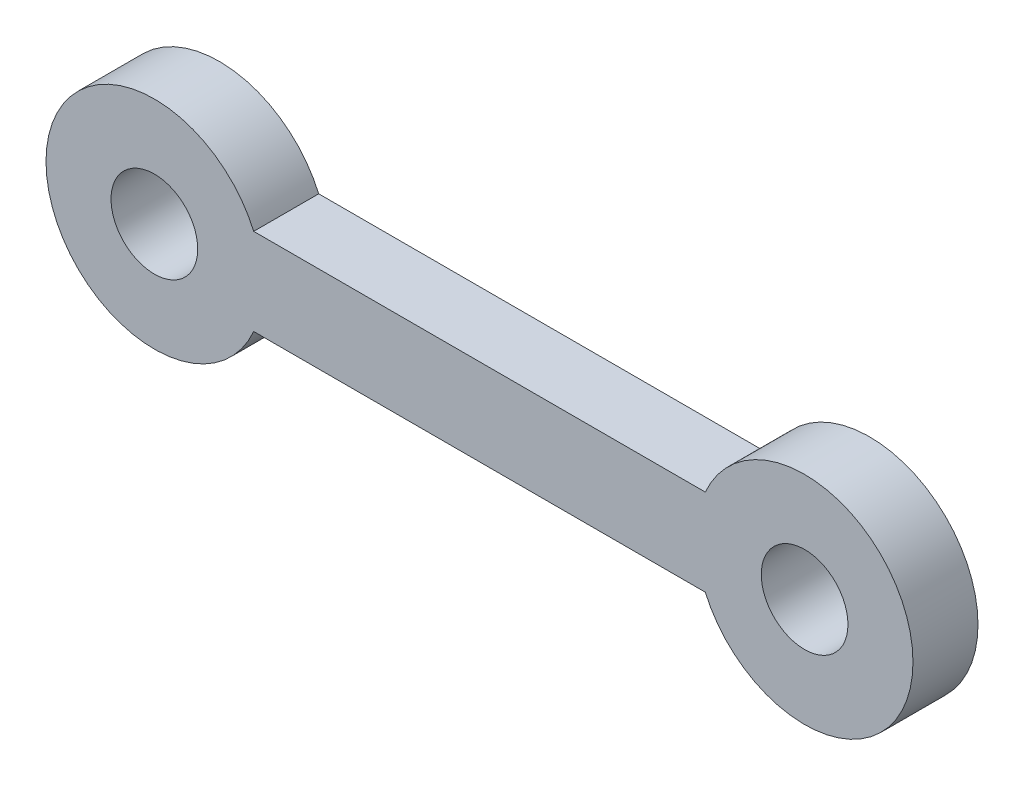
ISO-10303-21;
HEADER;
FILE_DESCRIPTION(('STEP AP214'),'2;1');
FILE_NAME('part.step','',(''),(''),'','','');
FILE_SCHEMA(('AUTOMOTIVE_DESIGN { 1 0 10303 214 1 1 1 1 }'));
ENDSEC;
DATA;
#1=APPLICATION_CONTEXT('core data for automotive mechanical design processes');
#2=APPLICATION_PROTOCOL_DEFINITION('international standard','automotive_design',2000,#1);
#3=PRODUCT_CONTEXT('',#1,'mechanical');
#4=PRODUCT('Part','Part','',(#3));
#5=PRODUCT_RELATED_PRODUCT_CATEGORY('part','',(#4));
#6=PRODUCT_DEFINITION_FORMATION('','',#4);
#7=PRODUCT_DEFINITION_CONTEXT('part definition',#1,'design');
#8=PRODUCT_DEFINITION('design','',#6,#7);
#9=PRODUCT_DEFINITION_SHAPE('','',#8);
#10=(LENGTH_UNIT() NAMED_UNIT(*) SI_UNIT(.MILLI.,.METRE.));
#11=(NAMED_UNIT(*) PLANE_ANGLE_UNIT() SI_UNIT($,.RADIAN.));
#12=(NAMED_UNIT(*) SI_UNIT($,.STERADIAN.) SOLID_ANGLE_UNIT());
#13=UNCERTAINTY_MEASURE_WITH_UNIT(LENGTH_MEASURE(1.E-05),#10,'distance_accuracy_value','');
#14=(GEOMETRIC_REPRESENTATION_CONTEXT(3) GLOBAL_UNCERTAINTY_ASSIGNED_CONTEXT((#13)) GLOBAL_UNIT_ASSIGNED_CONTEXT((#10,
#11,#12)) REPRESENTATION_CONTEXT('',''));
#15=CARTESIAN_POINT('',(0.,0.,0.));
#16=DIRECTION('',(0.,0.,1.));
#17=DIRECTION('',(1.,0.,0.));
#18=AXIS2_PLACEMENT_3D('',#15,#16,#17);
#19=CARTESIAN_POINT('',(30.,0.,1.5));
#20=DIRECTION('',(0.,0.,1.));
#21=DIRECTION('',(1.,0.,0.));
#22=AXIS2_PLACEMENT_3D('',#19,#20,#21);
#23=PLANE('',#22);
#24=CARTESIAN_POINT('',(0.,0.,1.5));
#25=DIRECTION('',(0.,0.,1.));
#26=DIRECTION('',(1.,0.,0.));
#27=AXIS2_PLACEMENT_3D('',#24,#25,#26);
#28=CIRCLE('',#27,2.);
#29=CARTESIAN_POINT('',(2.,0.,1.5));
#30=VERTEX_POINT('',#29);
#31=EDGE_CURVE('E112',#30,#30,#28,.T.);
#32=ORIENTED_EDGE('',*,*,#31,.F.);
#33=EDGE_LOOP('',(#32));
#34=FACE_BOUND('',#33,.T.);
#35=CARTESIAN_POINT('',(30.,0.,1.5));
#36=DIRECTION('',(0.,0.,1.));
#37=DIRECTION('',(1.,0.,0.));
#38=AXIS2_PLACEMENT_3D('',#35,#36,#37);
#39=CIRCLE('',#38,5.);
#40=CARTESIAN_POINT('',(25.4174243050442,-2.,1.5));
#41=VERTEX_POINT('',#40);
#42=CARTESIAN_POINT('',(25.4174243050442,2.,1.5));
#43=VERTEX_POINT('',#42);
#44=EDGE_CURVE('E92',#41,#43,#39,.T.);
#45=ORIENTED_EDGE('',*,*,#44,.T.);
#46=DIRECTION('',(-1.,0.,0.));
#47=VECTOR('',#46,1.);
#48=CARTESIAN_POINT('',(4.58257569495584,2.,1.5));
#49=LINE('',#48,#47);
#50=CARTESIAN_POINT('',(4.58257569495584,2.,1.5));
#51=VERTEX_POINT('',#50);
#52=EDGE_CURVE('E87',#43,#51,#49,.T.);
#53=ORIENTED_EDGE('',*,*,#52,.T.);
#54=CARTESIAN_POINT('',(0.,0.,1.5));
#55=DIRECTION('',(0.,0.,1.));
#56=DIRECTION('',(1.,0.,0.));
#57=AXIS2_PLACEMENT_3D('',#54,#55,#56);
#58=CIRCLE('',#57,5.);
#59=CARTESIAN_POINT('',(4.58257569495584,-2.,1.5));
#60=VERTEX_POINT('',#59);
#61=EDGE_CURVE('E90',#51,#60,#58,.T.);
#62=ORIENTED_EDGE('',*,*,#61,.T.);
#63=DIRECTION('',(1.,0.,0.));
#64=VECTOR('',#63,1.);
#65=CARTESIAN_POINT('',(4.58257569495584,-2.,1.5));
#66=LINE('',#65,#64);
#67=EDGE_CURVE('E57',#60,#41,#66,.T.);
#68=ORIENTED_EDGE('',*,*,#67,.T.);
#69=EDGE_LOOP('',(#45,#53,#62,#68));
#70=FACE_BOUND('',#69,.T.);
#71=CARTESIAN_POINT('',(30.,0.,1.5));
#72=DIRECTION('',(0.,0.,1.));
#73=DIRECTION('',(1.,0.,0.));
#74=AXIS2_PLACEMENT_3D('',#71,#72,#73);
#75=CIRCLE('',#74,2.);
#76=CARTESIAN_POINT('',(32.,0.,1.5));
#77=VERTEX_POINT('',#76);
#78=EDGE_CURVE('E134',#77,#77,#75,.T.);
#79=ORIENTED_EDGE('',*,*,#78,.F.);
#80=EDGE_LOOP('',(#79));
#81=FACE_BOUND('',#80,.T.);
#82=ADVANCED_FACE('F39',(#34,#70,#81),#23,.T.);
#83=CARTESIAN_POINT('',(30.,0.,-1.5));
#84=DIRECTION('',(0.,0.,1.));
#85=DIRECTION('',(1.,0.,0.));
#86=AXIS2_PLACEMENT_3D('',#83,#84,#85);
#87=PLANE('',#86);
#88=CARTESIAN_POINT('',(30.,0.,-1.5));
#89=DIRECTION('',(0.,0.,1.));
#90=DIRECTION('',(1.,0.,0.));
#91=AXIS2_PLACEMENT_3D('',#88,#89,#90);
#92=CIRCLE('',#91,5.);
#93=CARTESIAN_POINT('',(25.4174243050442,-2.,-1.5));
#94=VERTEX_POINT('',#93);
#95=CARTESIAN_POINT('',(25.4174243050442,2.,-1.5));
#96=VERTEX_POINT('',#95);
#97=EDGE_CURVE('E108',#94,#96,#92,.T.);
#98=ORIENTED_EDGE('',*,*,#97,.F.);
#99=DIRECTION('',(1.,0.,0.));
#100=VECTOR('',#99,1.);
#101=CARTESIAN_POINT('',(4.58257569495584,-2.,-1.5));
#102=LINE('',#101,#100);
#103=CARTESIAN_POINT('',(4.58257569495584,-2.,-1.5));
#104=VERTEX_POINT('',#103);
#105=EDGE_CURVE('E80',#104,#94,#102,.T.);
#106=ORIENTED_EDGE('',*,*,#105,.F.);
#107=CARTESIAN_POINT('',(0.,0.,-1.5));
#108=DIRECTION('',(0.,0.,1.));
#109=DIRECTION('',(1.,0.,0.));
#110=AXIS2_PLACEMENT_3D('',#107,#108,#109);
#111=CIRCLE('',#110,5.);
#112=CARTESIAN_POINT('',(4.58257569495584,2.,-1.5));
#113=VERTEX_POINT('',#112);
#114=EDGE_CURVE('E74',#113,#104,#111,.T.);
#115=ORIENTED_EDGE('',*,*,#114,.F.);
#116=DIRECTION('',(-1.,0.,0.));
#117=VECTOR('',#116,1.);
#118=CARTESIAN_POINT('',(4.58257569495584,2.,-1.5));
#119=LINE('',#118,#117);
#120=EDGE_CURVE('E97',#96,#113,#119,.T.);
#121=ORIENTED_EDGE('',*,*,#120,.F.);
#122=EDGE_LOOP('',(#98,#106,#115,#121));
#123=FACE_BOUND('',#122,.T.);
#124=CARTESIAN_POINT('',(0.,0.,-1.5));
#125=DIRECTION('',(0.,0.,1.));
#126=DIRECTION('',(1.,0.,0.));
#127=AXIS2_PLACEMENT_3D('',#124,#125,#126);
#128=CIRCLE('',#127,2.);
#129=CARTESIAN_POINT('',(2.,0.,-1.5));
#130=VERTEX_POINT('',#129);
#131=EDGE_CURVE('E130',#130,#130,#128,.T.);
#132=ORIENTED_EDGE('',*,*,#131,.T.);
#133=EDGE_LOOP('',(#132));
#134=FACE_BOUND('',#133,.T.);
#135=CARTESIAN_POINT('',(30.,0.,-1.5));
#136=DIRECTION('',(0.,0.,1.));
#137=DIRECTION('',(1.,0.,0.));
#138=AXIS2_PLACEMENT_3D('',#135,#136,#137);
#139=CIRCLE('',#138,2.);
#140=CARTESIAN_POINT('',(32.,0.,-1.5));
#141=VERTEX_POINT('',#140);
#142=EDGE_CURVE('E138',#141,#141,#139,.T.);
#143=ORIENTED_EDGE('',*,*,#142,.T.);
#144=EDGE_LOOP('',(#143));
#145=FACE_BOUND('',#144,.T.);
#146=ADVANCED_FACE('F125',(#123,#134,#145),#87,.F.);
#147=CARTESIAN_POINT('',(30.,0.,1.5));
#148=DIRECTION('',(0.,0.,-1.));
#149=DIRECTION('',(-1.,0.,0.));
#150=AXIS2_PLACEMENT_3D('',#147,#148,#149);
#151=CYLINDRICAL_SURFACE('',#150,5.);
#152=ORIENTED_EDGE('',*,*,#97,.T.);
#153=DIRECTION('',(0.,0.,-1.));
#154=VECTOR('',#153,1.);
#155=CARTESIAN_POINT('',(25.4174243050442,2.,1.5));
#156=LINE('',#155,#154);
#157=EDGE_CURVE('E11',#43,#96,#156,.T.);
#158=ORIENTED_EDGE('',*,*,#157,.F.);
#159=ORIENTED_EDGE('',*,*,#44,.F.);
#160=DIRECTION('',(0.,0.,-1.));
#161=VECTOR('',#160,1.);
#162=CARTESIAN_POINT('',(25.4174243050442,-2.,1.5));
#163=LINE('',#162,#161);
#164=EDGE_CURVE('E104',#41,#94,#163,.T.);
#165=ORIENTED_EDGE('',*,*,#164,.T.);
#166=EDGE_LOOP('',(#152,#158,#159,#165));
#167=FACE_BOUND('',#166,.T.);
#168=ADVANCED_FACE('F41',(#167),#151,.T.);
#169=CARTESIAN_POINT('',(4.58257569495584,2.,1.5));
#170=DIRECTION('',(0.,-1.,0.));
#171=DIRECTION('',(0.,0.,-1.));
#172=AXIS2_PLACEMENT_3D('',#169,#170,#171);
#173=PLANE('',#172);
#174=ORIENTED_EDGE('',*,*,#120,.T.);
#175=DIRECTION('',(0.,0.,-1.));
#176=VECTOR('',#175,1.);
#177=CARTESIAN_POINT('',(4.58257569495584,2.,1.5));
#178=LINE('',#177,#176);
#179=EDGE_CURVE('E49',#51,#113,#178,.T.);
#180=ORIENTED_EDGE('',*,*,#179,.F.);
#181=ORIENTED_EDGE('',*,*,#52,.F.);
#182=ORIENTED_EDGE('',*,*,#157,.T.);
#183=EDGE_LOOP('',(#174,#180,#181,#182));
#184=FACE_BOUND('',#183,.T.);
#185=ADVANCED_FACE('F96',(#184),#173,.F.);
#186=CARTESIAN_POINT('',(0.,0.,1.5));
#187=DIRECTION('',(0.,0.,-1.));
#188=DIRECTION('',(-1.,0.,0.));
#189=AXIS2_PLACEMENT_3D('',#186,#187,#188);
#190=CYLINDRICAL_SURFACE('',#189,5.);
#191=ORIENTED_EDGE('',*,*,#114,.T.);
#192=DIRECTION('',(0.,0.,-1.));
#193=VECTOR('',#192,1.);
#194=CARTESIAN_POINT('',(4.58257569495584,-2.,1.5));
#195=LINE('',#194,#193);
#196=EDGE_CURVE('E99',#60,#104,#195,.T.);
#197=ORIENTED_EDGE('',*,*,#196,.F.);
#198=ORIENTED_EDGE('',*,*,#61,.F.);
#199=ORIENTED_EDGE('',*,*,#179,.T.);
#200=EDGE_LOOP('',(#191,#197,#198,#199));
#201=FACE_BOUND('',#200,.T.);
#202=ADVANCED_FACE('F100',(#201),#190,.T.);
#203=CARTESIAN_POINT('',(4.58257569495584,-2.,1.5));
#204=DIRECTION('',(0.,1.,0.));
#205=DIRECTION('',(0.,0.,1.));
#206=AXIS2_PLACEMENT_3D('',#203,#204,#205);
#207=PLANE('',#206);
#208=ORIENTED_EDGE('',*,*,#105,.T.);
#209=ORIENTED_EDGE('',*,*,#164,.F.);
#210=ORIENTED_EDGE('',*,*,#67,.F.);
#211=ORIENTED_EDGE('',*,*,#196,.T.);
#212=EDGE_LOOP('',(#208,#209,#210,#211));
#213=FACE_BOUND('',#212,.T.);
#214=ADVANCED_FACE('F122',(#213),#207,.F.);
#215=CARTESIAN_POINT('',(0.,0.,1.5));
#216=DIRECTION('',(0.,0.,-1.));
#217=DIRECTION('',(-1.,0.,0.));
#218=AXIS2_PLACEMENT_3D('',#215,#216,#217);
#219=CYLINDRICAL_SURFACE('',#218,2.);
#220=ORIENTED_EDGE('',*,*,#31,.T.);
#221=EDGE_LOOP('',(#220));
#222=FACE_BOUND('',#221,.T.);
#223=ORIENTED_EDGE('',*,*,#131,.F.);
#224=EDGE_LOOP('',(#223));
#225=FACE_BOUND('',#224,.T.);
#226=ADVANCED_FACE('F157',(#222,#225),#219,.F.);
#227=CARTESIAN_POINT('',(30.,0.,1.5));
#228=DIRECTION('',(0.,0.,-1.));
#229=DIRECTION('',(-1.,0.,0.));
#230=AXIS2_PLACEMENT_3D('',#227,#228,#229);
#231=CYLINDRICAL_SURFACE('',#230,2.);
#232=ORIENTED_EDGE('',*,*,#78,.T.);
#233=EDGE_LOOP('',(#232));
#234=FACE_BOUND('',#233,.T.);
#235=ORIENTED_EDGE('',*,*,#142,.F.);
#236=EDGE_LOOP('',(#235));
#237=FACE_BOUND('',#236,.T.);
#238=ADVANCED_FACE('F146',(#234,#237),#231,.F.);
#239=CLOSED_SHELL('',(#82,#146,#168,#185,#202,#214,#226,#238));
#240=MANIFOLD_SOLID_BREP('B2',#239);
#241=ADVANCED_BREP_SHAPE_REPRESENTATION('',(#18,#240),#14);
#242=SHAPE_DEFINITION_REPRESENTATION(#9,#241);
ENDSEC;
END-ISO-10303-21;
